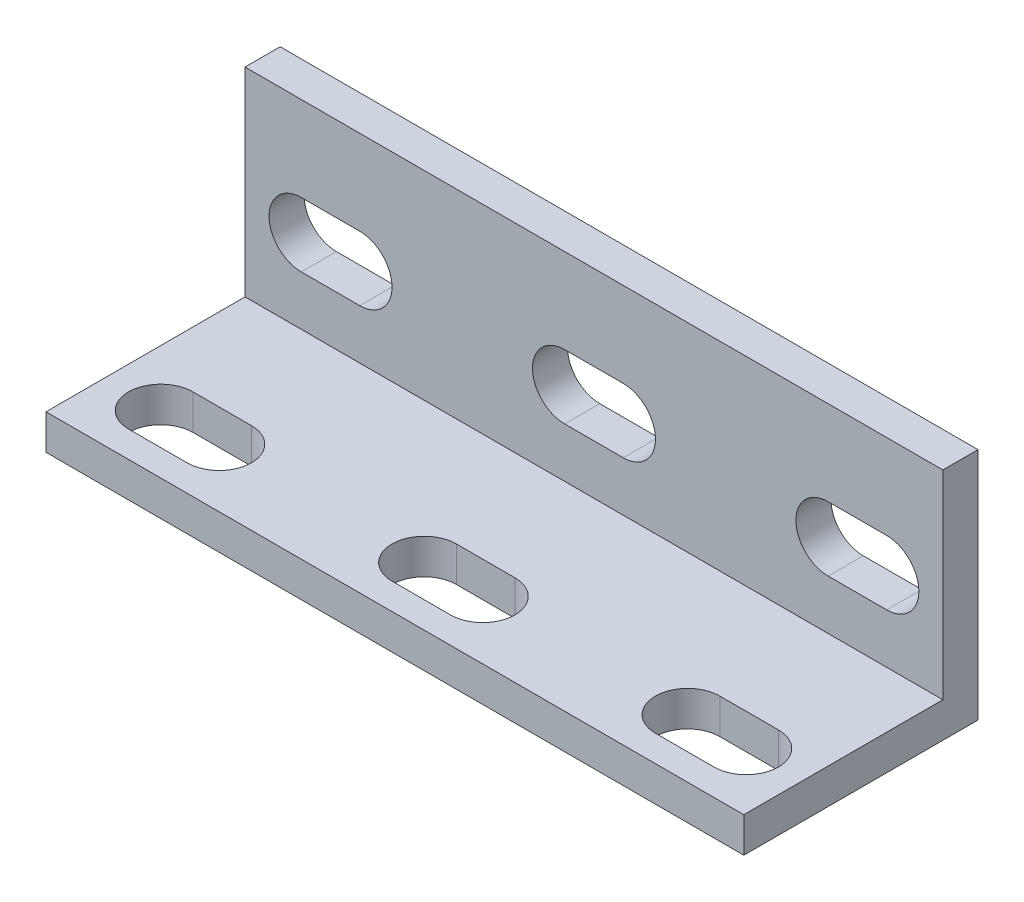
ISO-10303-21;
HEADER;
FILE_DESCRIPTION(('STEP AP214'),'2;1');
FILE_NAME('part.step','',(''),(''),'','','');
FILE_SCHEMA(('AUTOMOTIVE_DESIGN { 1 0 10303 214 1 1 1 1 }'));
ENDSEC;
DATA;
#1=APPLICATION_CONTEXT('core data for automotive mechanical design processes');
#2=APPLICATION_PROTOCOL_DEFINITION('international standard','automotive_design',2000,#1);
#3=PRODUCT_CONTEXT('',#1,'mechanical');
#4=PRODUCT('Part','Part','',(#3));
#5=PRODUCT_RELATED_PRODUCT_CATEGORY('part','',(#4));
#6=PRODUCT_DEFINITION_FORMATION('','',#4);
#7=PRODUCT_DEFINITION_CONTEXT('part definition',#1,'design');
#8=PRODUCT_DEFINITION('design','',#6,#7);
#9=PRODUCT_DEFINITION_SHAPE('','',#8);
#10=(LENGTH_UNIT() NAMED_UNIT(*) SI_UNIT(.MILLI.,.METRE.));
#11=(NAMED_UNIT(*) PLANE_ANGLE_UNIT() SI_UNIT($,.RADIAN.));
#12=(NAMED_UNIT(*) SI_UNIT($,.STERADIAN.) SOLID_ANGLE_UNIT());
#13=UNCERTAINTY_MEASURE_WITH_UNIT(LENGTH_MEASURE(1.E-05),#10,'distance_accuracy_value','');
#14=(GEOMETRIC_REPRESENTATION_CONTEXT(3) GLOBAL_UNCERTAINTY_ASSIGNED_CONTEXT((#13)) GLOBAL_UNIT_ASSIGNED_CONTEXT((#10,
#11,#12)) REPRESENTATION_CONTEXT('',''));
#15=CARTESIAN_POINT('',(0.,0.,0.));
#16=DIRECTION('',(0.,0.,1.));
#17=DIRECTION('',(1.,0.,0.));
#18=AXIS2_PLACEMENT_3D('',#15,#16,#17);
#19=CARTESIAN_POINT('',(29.8,0.,20.));
#20=DIRECTION('',(0.,1.,0.));
#21=DIRECTION('',(0.,0.,1.));
#22=AXIS2_PLACEMENT_3D('',#19,#20,#21);
#23=PLANE('',#22);
#24=DIRECTION('',(1.,0.,0.));
#25=VECTOR('',#24,1.);
#26=CARTESIAN_POINT('',(-25.,0.,12.2500000000002));
#27=LINE('',#26,#25);
#28=CARTESIAN_POINT('',(-25.,0.,12.2500000000002));
#29=VERTEX_POINT('',#28);
#30=CARTESIAN_POINT('',(-20.,0.,12.2500000000002));
#31=VERTEX_POINT('',#30);
#32=EDGE_CURVE('E324',#29,#31,#27,.T.);
#33=ORIENTED_EDGE('',*,*,#32,.F.);
#34=CARTESIAN_POINT('',(-25.,0.,15.0000000000002));
#35=DIRECTION('',(0.,1.,0.));
#36=DIRECTION('',(0.,0.,1.));
#37=AXIS2_PLACEMENT_3D('',#34,#35,#36);
#38=CIRCLE('',#37,2.75);
#39=CARTESIAN_POINT('',(-25.,0.,17.7500000000002));
#40=VERTEX_POINT('',#39);
#41=EDGE_CURVE('E327',#40,#29,#38,.F.);
#42=ORIENTED_EDGE('',*,*,#41,.F.);
#43=DIRECTION('',(-1.,0.,0.));
#44=VECTOR('',#43,1.);
#45=CARTESIAN_POINT('',(-25.,0.,17.7500000000002));
#46=LINE('',#45,#44);
#47=CARTESIAN_POINT('',(-20.,0.,17.7500000000002));
#48=VERTEX_POINT('',#47);
#49=EDGE_CURVE('E329',#48,#40,#46,.T.);
#50=ORIENTED_EDGE('',*,*,#49,.F.);
#51=CARTESIAN_POINT('',(-20.,0.,15.0000000000002));
#52=DIRECTION('',(0.,1.,0.));
#53=DIRECTION('',(0.,0.,1.));
#54=AXIS2_PLACEMENT_3D('',#51,#52,#53);
#55=CIRCLE('',#54,2.75);
#56=EDGE_CURVE('E321',#31,#48,#55,.F.);
#57=ORIENTED_EDGE('',*,*,#56,.F.);
#58=EDGE_LOOP('',(#33,#42,#50,#57));
#59=FACE_BOUND('',#58,.T.);
#60=DIRECTION('',(1.,0.,0.));
#61=VECTOR('',#60,1.);
#62=CARTESIAN_POINT('',(20.,0.,12.25));
#63=LINE('',#62,#61);
#64=CARTESIAN_POINT('',(20.,0.,12.25));
#65=VERTEX_POINT('',#64);
#66=CARTESIAN_POINT('',(25.,0.,12.25));
#67=VERTEX_POINT('',#66);
#68=EDGE_CURVE('E353',#65,#67,#63,.T.);
#69=ORIENTED_EDGE('',*,*,#68,.F.);
#70=CARTESIAN_POINT('',(20.,0.,15.));
#71=DIRECTION('',(0.,1.,0.));
#72=DIRECTION('',(0.,0.,1.));
#73=AXIS2_PLACEMENT_3D('',#70,#71,#72);
#74=CIRCLE('',#73,2.75);
#75=CARTESIAN_POINT('',(20.,0.,17.75));
#76=VERTEX_POINT('',#75);
#77=EDGE_CURVE('E356',#76,#65,#74,.F.);
#78=ORIENTED_EDGE('',*,*,#77,.F.);
#79=DIRECTION('',(-1.,0.,0.));
#80=VECTOR('',#79,1.);
#81=CARTESIAN_POINT('',(20.,0.,17.75));
#82=LINE('',#81,#80);
#83=CARTESIAN_POINT('',(25.,0.,17.75));
#84=VERTEX_POINT('',#83);
#85=EDGE_CURVE('E358',#84,#76,#82,.T.);
#86=ORIENTED_EDGE('',*,*,#85,.F.);
#87=CARTESIAN_POINT('',(25.,0.,15.));
#88=DIRECTION('',(0.,1.,0.));
#89=DIRECTION('',(0.,0.,1.));
#90=AXIS2_PLACEMENT_3D('',#87,#88,#89);
#91=CIRCLE('',#90,2.75);
#92=EDGE_CURVE('E350',#67,#84,#91,.F.);
#93=ORIENTED_EDGE('',*,*,#92,.F.);
#94=EDGE_LOOP('',(#69,#78,#86,#93));
#95=FACE_BOUND('',#94,.T.);
#96=DIRECTION('',(1.,0.,0.));
#97=VECTOR('',#96,1.);
#98=CARTESIAN_POINT('',(-2.5,0.,12.25));
#99=LINE('',#98,#97);
#100=CARTESIAN_POINT('',(-2.5,0.,12.25));
#101=VERTEX_POINT('',#100);
#102=CARTESIAN_POINT('',(2.5,0.,12.25));
#103=VERTEX_POINT('',#102);
#104=EDGE_CURVE('E382',#101,#103,#99,.T.);
#105=ORIENTED_EDGE('',*,*,#104,.F.);
#106=CARTESIAN_POINT('',(-2.5,0.,15.));
#107=DIRECTION('',(0.,1.,0.));
#108=DIRECTION('',(0.,0.,1.));
#109=AXIS2_PLACEMENT_3D('',#106,#107,#108);
#110=CIRCLE('',#109,2.75);
#111=CARTESIAN_POINT('',(-2.5,0.,17.75));
#112=VERTEX_POINT('',#111);
#113=EDGE_CURVE('E385',#112,#101,#110,.F.);
#114=ORIENTED_EDGE('',*,*,#113,.F.);
#115=DIRECTION('',(-1.,0.,0.));
#116=VECTOR('',#115,1.);
#117=CARTESIAN_POINT('',(-2.5,0.,17.75));
#118=LINE('',#117,#116);
#119=CARTESIAN_POINT('',(2.5,0.,17.75));
#120=VERTEX_POINT('',#119);
#121=EDGE_CURVE('E387',#120,#112,#118,.T.);
#122=ORIENTED_EDGE('',*,*,#121,.F.);
#123=CARTESIAN_POINT('',(2.5,0.,15.));
#124=DIRECTION('',(0.,1.,0.));
#125=DIRECTION('',(0.,0.,1.));
#126=AXIS2_PLACEMENT_3D('',#123,#124,#125);
#127=CIRCLE('',#126,2.75);
#128=EDGE_CURVE('E379',#103,#120,#127,.F.);
#129=ORIENTED_EDGE('',*,*,#128,.F.);
#130=EDGE_LOOP('',(#105,#114,#122,#129));
#131=FACE_BOUND('',#130,.T.);
#132=DIRECTION('',(0.,0.,-1.));
#133=VECTOR('',#132,1.);
#134=CARTESIAN_POINT('',(-29.8,0.,20.));
#135=LINE('',#134,#133);
#136=CARTESIAN_POINT('',(-29.8,0.,20.));
#137=VERTEX_POINT('',#136);
#138=CARTESIAN_POINT('',(-29.8,0.,0.));
#139=VERTEX_POINT('',#138);
#140=EDGE_CURVE('E407',#137,#139,#135,.T.);
#141=ORIENTED_EDGE('',*,*,#140,.T.);
#142=DIRECTION('',(-1.,0.,0.));
#143=VECTOR('',#142,1.);
#144=CARTESIAN_POINT('',(29.8,0.,0.));
#145=LINE('',#144,#143);
#146=CARTESIAN_POINT('',(29.8,0.,0.));
#147=VERTEX_POINT('',#146);
#148=EDGE_CURVE('E11',#147,#139,#145,.T.);
#149=ORIENTED_EDGE('',*,*,#148,.F.);
#150=DIRECTION('',(0.,0.,-1.));
#151=VECTOR('',#150,1.);
#152=CARTESIAN_POINT('',(29.8,0.,20.));
#153=LINE('',#152,#151);
#154=CARTESIAN_POINT('',(29.8,0.,20.));
#155=VERTEX_POINT('',#154);
#156=EDGE_CURVE('E408',#155,#147,#153,.T.);
#157=ORIENTED_EDGE('',*,*,#156,.F.);
#158=DIRECTION('',(-1.,0.,0.));
#159=VECTOR('',#158,1.);
#160=CARTESIAN_POINT('',(29.8,0.,20.));
#161=LINE('',#160,#159);
#162=EDGE_CURVE('E422',#155,#137,#161,.T.);
#163=ORIENTED_EDGE('',*,*,#162,.T.);
#164=EDGE_LOOP('',(#141,#149,#157,#163));
#165=FACE_BOUND('',#164,.T.);
#166=ADVANCED_FACE('F35',(#59,#95,#131,#165),#23,.F.);
#167=CARTESIAN_POINT('',(29.8,0.,0.));
#168=DIRECTION('',(0.,0.,1.));
#169=DIRECTION('',(1.,0.,0.));
#170=AXIS2_PLACEMENT_3D('',#167,#168,#169);
#171=PLANE('',#170);
#172=DIRECTION('',(-1.,0.,0.));
#173=VECTOR('',#172,1.);
#174=CARTESIAN_POINT('',(-20.,7.24999999999985,0.));
#175=LINE('',#174,#173);
#176=CARTESIAN_POINT('',(-20.,7.24999999999985,0.));
#177=VERTEX_POINT('',#176);
#178=CARTESIAN_POINT('',(-25.,7.24999999999985,0.));
#179=VERTEX_POINT('',#178);
#180=EDGE_CURVE('E770',#177,#179,#175,.T.);
#181=ORIENTED_EDGE('',*,*,#180,.F.);
#182=CARTESIAN_POINT('',(-20.,9.99999999999984,0.));
#183=DIRECTION('',(0.,0.,1.));
#184=DIRECTION('',(1.,0.,0.));
#185=AXIS2_PLACEMENT_3D('',#182,#183,#184);
#186=CIRCLE('',#185,2.75);
#187=CARTESIAN_POINT('',(-20.,12.7499999999998,0.));
#188=VERTEX_POINT('',#187);
#189=EDGE_CURVE('E262',#188,#177,#186,.F.);
#190=ORIENTED_EDGE('',*,*,#189,.F.);
#191=DIRECTION('',(1.,0.,0.));
#192=VECTOR('',#191,1.);
#193=CARTESIAN_POINT('',(-25.,12.7499999999998,0.));
#194=LINE('',#193,#192);
#195=CARTESIAN_POINT('',(-25.,12.7499999999998,0.));
#196=VERTEX_POINT('',#195);
#197=EDGE_CURVE('E259',#196,#188,#194,.T.);
#198=ORIENTED_EDGE('',*,*,#197,.F.);
#199=CARTESIAN_POINT('',(-25.,9.99999999999984,0.));
#200=DIRECTION('',(0.,0.,1.));
#201=DIRECTION('',(1.,0.,0.));
#202=AXIS2_PLACEMENT_3D('',#199,#200,#201);
#203=CIRCLE('',#202,2.75);
#204=EDGE_CURVE('E237',#179,#196,#203,.F.);
#205=ORIENTED_EDGE('',*,*,#204,.F.);
#206=EDGE_LOOP('',(#181,#190,#198,#205));
#207=FACE_BOUND('',#206,.T.);
#208=DIRECTION('',(-1.,0.,0.));
#209=VECTOR('',#208,1.);
#210=CARTESIAN_POINT('',(25.,7.25,0.));
#211=LINE('',#210,#209);
#212=CARTESIAN_POINT('',(25.,7.25,0.));
#213=VERTEX_POINT('',#212);
#214=CARTESIAN_POINT('',(20.,7.25,0.));
#215=VERTEX_POINT('',#214);
#216=EDGE_CURVE('E266',#213,#215,#211,.T.);
#217=ORIENTED_EDGE('',*,*,#216,.F.);
#218=CARTESIAN_POINT('',(25.,10.,0.));
#219=DIRECTION('',(0.,0.,1.));
#220=DIRECTION('',(1.,0.,0.));
#221=AXIS2_PLACEMENT_3D('',#218,#219,#220);
#222=CIRCLE('',#221,2.75);
#223=CARTESIAN_POINT('',(25.,12.75,0.));
#224=VERTEX_POINT('',#223);
#225=EDGE_CURVE('E269',#224,#213,#222,.F.);
#226=ORIENTED_EDGE('',*,*,#225,.F.);
#227=DIRECTION('',(1.,0.,0.));
#228=VECTOR('',#227,1.);
#229=CARTESIAN_POINT('',(20.,12.75,0.));
#230=LINE('',#229,#228);
#231=CARTESIAN_POINT('',(20.,12.75,0.));
#232=VERTEX_POINT('',#231);
#233=EDGE_CURVE('E271',#232,#224,#230,.T.);
#234=ORIENTED_EDGE('',*,*,#233,.F.);
#235=CARTESIAN_POINT('',(20.,10.,0.));
#236=DIRECTION('',(0.,0.,1.));
#237=DIRECTION('',(1.,0.,0.));
#238=AXIS2_PLACEMENT_3D('',#235,#236,#237);
#239=CIRCLE('',#238,2.75);
#240=EDGE_CURVE('E263',#215,#232,#239,.F.);
#241=ORIENTED_EDGE('',*,*,#240,.F.);
#242=EDGE_LOOP('',(#217,#226,#234,#241));
#243=FACE_BOUND('',#242,.T.);
#244=DIRECTION('',(-1.,0.,0.));
#245=VECTOR('',#244,1.);
#246=CARTESIAN_POINT('',(2.5,7.25,0.));
#247=LINE('',#246,#245);
#248=CARTESIAN_POINT('',(2.5,7.25,0.));
#249=VERTEX_POINT('',#248);
#250=CARTESIAN_POINT('',(-2.5,7.25,0.));
#251=VERTEX_POINT('',#250);
#252=EDGE_CURVE('E295',#249,#251,#247,.T.);
#253=ORIENTED_EDGE('',*,*,#252,.F.);
#254=CARTESIAN_POINT('',(2.5,10.,0.));
#255=DIRECTION('',(0.,0.,1.));
#256=DIRECTION('',(1.,0.,0.));
#257=AXIS2_PLACEMENT_3D('',#254,#255,#256);
#258=CIRCLE('',#257,2.75);
#259=CARTESIAN_POINT('',(2.5,12.75,0.));
#260=VERTEX_POINT('',#259);
#261=EDGE_CURVE('E298',#260,#249,#258,.F.);
#262=ORIENTED_EDGE('',*,*,#261,.F.);
#263=DIRECTION('',(1.,0.,0.));
#264=VECTOR('',#263,1.);
#265=CARTESIAN_POINT('',(-2.5,12.75,0.));
#266=LINE('',#265,#264);
#267=CARTESIAN_POINT('',(-2.5,12.75,0.));
#268=VERTEX_POINT('',#267);
#269=EDGE_CURVE('E300',#268,#260,#266,.T.);
#270=ORIENTED_EDGE('',*,*,#269,.F.);
#271=CARTESIAN_POINT('',(-2.5,10.,0.));
#272=DIRECTION('',(0.,0.,1.));
#273=DIRECTION('',(1.,0.,0.));
#274=AXIS2_PLACEMENT_3D('',#271,#272,#273);
#275=CIRCLE('',#274,2.75);
#276=EDGE_CURVE('E292',#251,#268,#275,.F.);
#277=ORIENTED_EDGE('',*,*,#276,.F.);
#278=EDGE_LOOP('',(#253,#262,#270,#277));
#279=FACE_BOUND('',#278,.T.);
#280=DIRECTION('',(0.,1.,0.));
#281=VECTOR('',#280,1.);
#282=CARTESIAN_POINT('',(-29.8,0.,0.));
#283=LINE('',#282,#281);
#284=CARTESIAN_POINT('',(-29.8,20.,0.));
#285=VERTEX_POINT('',#284);
#286=EDGE_CURVE('E425',#139,#285,#283,.T.);
#287=ORIENTED_EDGE('',*,*,#286,.T.);
#288=DIRECTION('',(-1.,0.,0.));
#289=VECTOR('',#288,1.);
#290=CARTESIAN_POINT('',(29.8,20.,0.));
#291=LINE('',#290,#289);
#292=CARTESIAN_POINT('',(29.8,20.,0.));
#293=VERTEX_POINT('',#292);
#294=EDGE_CURVE('E42',#293,#285,#291,.T.);
#295=ORIENTED_EDGE('',*,*,#294,.F.);
#296=DIRECTION('',(0.,1.,0.));
#297=VECTOR('',#296,1.);
#298=CARTESIAN_POINT('',(29.8,0.,0.));
#299=LINE('',#298,#297);
#300=EDGE_CURVE('E411',#147,#293,#299,.T.);
#301=ORIENTED_EDGE('',*,*,#300,.F.);
#302=ORIENTED_EDGE('',*,*,#148,.T.);
#303=EDGE_LOOP('',(#287,#295,#301,#302));
#304=FACE_BOUND('',#303,.T.);
#305=ADVANCED_FACE('F471',(#207,#243,#279,#304),#171,.F.);
#306=CARTESIAN_POINT('',(29.8,20.,0.));
#307=DIRECTION('',(0.,-1.,0.));
#308=DIRECTION('',(0.,0.,-1.));
#309=AXIS2_PLACEMENT_3D('',#306,#307,#308);
#310=PLANE('',#309);
#311=DIRECTION('',(0.,0.,1.));
#312=VECTOR('',#311,1.);
#313=CARTESIAN_POINT('',(-29.8,20.,0.));
#314=LINE('',#313,#312);
#315=CARTESIAN_POINT('',(-29.8,20.,3.));
#316=VERTEX_POINT('',#315);
#317=EDGE_CURVE('E427',#285,#316,#314,.T.);
#318=ORIENTED_EDGE('',*,*,#317,.T.);
#319=DIRECTION('',(-1.,0.,0.));
#320=VECTOR('',#319,1.);
#321=CARTESIAN_POINT('',(29.8,20.,3.));
#322=LINE('',#321,#320);
#323=CARTESIAN_POINT('',(29.8,20.,3.));
#324=VERTEX_POINT('',#323);
#325=EDGE_CURVE('E442',#324,#316,#322,.T.);
#326=ORIENTED_EDGE('',*,*,#325,.F.);
#327=DIRECTION('',(0.,0.,1.));
#328=VECTOR('',#327,1.);
#329=CARTESIAN_POINT('',(29.8,20.,0.));
#330=LINE('',#329,#328);
#331=EDGE_CURVE('E414',#293,#324,#330,.T.);
#332=ORIENTED_EDGE('',*,*,#331,.F.);
#333=ORIENTED_EDGE('',*,*,#294,.T.);
#334=EDGE_LOOP('',(#318,#326,#332,#333));
#335=FACE_BOUND('',#334,.T.);
#336=ADVANCED_FACE('F449',(#335),#310,.F.);
#337=CARTESIAN_POINT('',(29.8,20.,3.));
#338=DIRECTION('',(0.,0.,-1.));
#339=DIRECTION('',(0.,1.,0.));
#340=AXIS2_PLACEMENT_3D('',#337,#338,#339);
#341=PLANE('',#340);
#342=DIRECTION('',(-1.,0.,0.));
#343=VECTOR('',#342,1.);
#344=CARTESIAN_POINT('',(-25.,12.7499999999998,3.));
#345=LINE('',#344,#343);
#346=CARTESIAN_POINT('',(-20.,12.7499999999998,3.));
#347=VERTEX_POINT('',#346);
#348=CARTESIAN_POINT('',(-25.,12.7499999999998,3.));
#349=VERTEX_POINT('',#348);
#350=EDGE_CURVE('E243',#347,#349,#345,.T.);
#351=ORIENTED_EDGE('',*,*,#350,.F.);
#352=CARTESIAN_POINT('',(-20.,9.99999999999984,3.));
#353=DIRECTION('',(0.,0.,1.));
#354=DIRECTION('',(1.,0.,0.));
#355=AXIS2_PLACEMENT_3D('',#352,#353,#354);
#356=CIRCLE('',#355,2.75);
#357=CARTESIAN_POINT('',(-20.,7.24999999999985,3.));
#358=VERTEX_POINT('',#357);
#359=EDGE_CURVE('E57',#358,#347,#356,.T.);
#360=ORIENTED_EDGE('',*,*,#359,.F.);
#361=DIRECTION('',(1.,0.,0.));
#362=VECTOR('',#361,1.);
#363=CARTESIAN_POINT('',(-20.,7.24999999999985,3.));
#364=LINE('',#363,#362);
#365=CARTESIAN_POINT('',(-25.,7.24999999999985,3.));
#366=VERTEX_POINT('',#365);
#367=EDGE_CURVE('E250',#366,#358,#364,.T.);
#368=ORIENTED_EDGE('',*,*,#367,.F.);
#369=CARTESIAN_POINT('',(-25.,9.99999999999984,3.));
#370=DIRECTION('',(0.,0.,1.));
#371=DIRECTION('',(1.,0.,0.));
#372=AXIS2_PLACEMENT_3D('',#369,#370,#371);
#373=CIRCLE('',#372,2.75);
#374=EDGE_CURVE('E234',#349,#366,#373,.T.);
#375=ORIENTED_EDGE('',*,*,#374,.F.);
#376=EDGE_LOOP('',(#351,#360,#368,#375));
#377=FACE_BOUND('',#376,.T.);
#378=DIRECTION('',(-1.,0.,0.));
#379=VECTOR('',#378,1.);
#380=CARTESIAN_POINT('',(20.,12.75,3.));
#381=LINE('',#380,#379);
#382=CARTESIAN_POINT('',(25.,12.75,3.));
#383=VERTEX_POINT('',#382);
#384=CARTESIAN_POINT('',(20.,12.75,3.));
#385=VERTEX_POINT('',#384);
#386=EDGE_CURVE('E273',#383,#385,#381,.T.);
#387=ORIENTED_EDGE('',*,*,#386,.F.);
#388=CARTESIAN_POINT('',(25.,10.,3.));
#389=DIRECTION('',(0.,0.,1.));
#390=DIRECTION('',(1.,0.,0.));
#391=AXIS2_PLACEMENT_3D('',#388,#389,#390);
#392=CIRCLE('',#391,2.75);
#393=CARTESIAN_POINT('',(25.,7.25,3.));
#394=VERTEX_POINT('',#393);
#395=EDGE_CURVE('E261',#394,#383,#392,.T.);
#396=ORIENTED_EDGE('',*,*,#395,.F.);
#397=DIRECTION('',(1.,0.,0.));
#398=VECTOR('',#397,1.);
#399=CARTESIAN_POINT('',(25.,7.25,3.));
#400=LINE('',#399,#398);
#401=CARTESIAN_POINT('',(20.,7.25,3.));
#402=VERTEX_POINT('',#401);
#403=EDGE_CURVE('E279',#402,#394,#400,.T.);
#404=ORIENTED_EDGE('',*,*,#403,.F.);
#405=CARTESIAN_POINT('',(20.,10.,3.));
#406=DIRECTION('',(0.,0.,1.));
#407=DIRECTION('',(1.,0.,0.));
#408=AXIS2_PLACEMENT_3D('',#405,#406,#407);
#409=CIRCLE('',#408,2.75);
#410=EDGE_CURVE('E276',#385,#402,#409,.T.);
#411=ORIENTED_EDGE('',*,*,#410,.F.);
#412=EDGE_LOOP('',(#387,#396,#404,#411));
#413=FACE_BOUND('',#412,.T.);
#414=DIRECTION('',(-1.,0.,0.));
#415=VECTOR('',#414,1.);
#416=CARTESIAN_POINT('',(-2.5,12.75,3.));
#417=LINE('',#416,#415);
#418=CARTESIAN_POINT('',(2.5,12.75,3.));
#419=VERTEX_POINT('',#418);
#420=CARTESIAN_POINT('',(-2.5,12.75,3.));
#421=VERTEX_POINT('',#420);
#422=EDGE_CURVE('E302',#419,#421,#417,.T.);
#423=ORIENTED_EDGE('',*,*,#422,.F.);
#424=CARTESIAN_POINT('',(2.5,10.,3.));
#425=DIRECTION('',(0.,0.,1.));
#426=DIRECTION('',(1.,0.,0.));
#427=AXIS2_PLACEMENT_3D('',#424,#425,#426);
#428=CIRCLE('',#427,2.75);
#429=CARTESIAN_POINT('',(2.5,7.25,3.));
#430=VERTEX_POINT('',#429);
#431=EDGE_CURVE('E291',#430,#419,#428,.T.);
#432=ORIENTED_EDGE('',*,*,#431,.F.);
#433=DIRECTION('',(1.,0.,0.));
#434=VECTOR('',#433,1.);
#435=CARTESIAN_POINT('',(2.5,7.25,3.));
#436=LINE('',#435,#434);
#437=CARTESIAN_POINT('',(-2.5,7.25,3.));
#438=VERTEX_POINT('',#437);
#439=EDGE_CURVE('E308',#438,#430,#436,.T.);
#440=ORIENTED_EDGE('',*,*,#439,.F.);
#441=CARTESIAN_POINT('',(-2.5,10.,3.));
#442=DIRECTION('',(0.,0.,1.));
#443=DIRECTION('',(1.,0.,0.));
#444=AXIS2_PLACEMENT_3D('',#441,#442,#443);
#445=CIRCLE('',#444,2.75);
#446=EDGE_CURVE('E305',#421,#438,#445,.T.);
#447=ORIENTED_EDGE('',*,*,#446,.F.);
#448=EDGE_LOOP('',(#423,#432,#440,#447));
#449=FACE_BOUND('',#448,.T.);
#450=DIRECTION('',(0.,-1.,0.));
#451=VECTOR('',#450,1.);
#452=CARTESIAN_POINT('',(-29.8,20.,3.));
#453=LINE('',#452,#451);
#454=CARTESIAN_POINT('',(-29.8,3.,3.));
#455=VERTEX_POINT('',#454);
#456=EDGE_CURVE('E429',#316,#455,#453,.T.);
#457=ORIENTED_EDGE('',*,*,#456,.T.);
#458=DIRECTION('',(-1.,0.,0.));
#459=VECTOR('',#458,1.);
#460=CARTESIAN_POINT('',(29.8,3.,3.));
#461=LINE('',#460,#459);
#462=CARTESIAN_POINT('',(29.8,3.,3.));
#463=VERTEX_POINT('',#462);
#464=EDGE_CURVE('E439',#463,#455,#461,.T.);
#465=ORIENTED_EDGE('',*,*,#464,.F.);
#466=DIRECTION('',(0.,-1.,0.));
#467=VECTOR('',#466,1.);
#468=CARTESIAN_POINT('',(29.8,20.,3.));
#469=LINE('',#468,#467);
#470=EDGE_CURVE('E416',#324,#463,#469,.T.);
#471=ORIENTED_EDGE('',*,*,#470,.F.);
#472=ORIENTED_EDGE('',*,*,#325,.T.);
#473=EDGE_LOOP('',(#457,#465,#471,#472));
#474=FACE_BOUND('',#473,.T.);
#475=ADVANCED_FACE('F247',(#377,#413,#449,#474),#341,.F.);
#476=CARTESIAN_POINT('',(29.8,3.,3.));
#477=DIRECTION('',(0.,-1.,0.));
#478=DIRECTION('',(0.,0.,-1.));
#479=AXIS2_PLACEMENT_3D('',#476,#477,#478);
#480=PLANE('',#479);
#481=DIRECTION('',(1.,0.,0.));
#482=VECTOR('',#481,1.);
#483=CARTESIAN_POINT('',(-25.,3.,17.7500000000002));
#484=LINE('',#483,#482);
#485=CARTESIAN_POINT('',(-25.,3.,17.7500000000002));
#486=VERTEX_POINT('',#485);
#487=CARTESIAN_POINT('',(-20.,3.,17.7500000000002));
#488=VERTEX_POINT('',#487);
#489=EDGE_CURVE('E331',#486,#488,#484,.T.);
#490=ORIENTED_EDGE('',*,*,#489,.F.);
#491=CARTESIAN_POINT('',(-25.,3.,15.0000000000002));
#492=DIRECTION('',(0.,1.,0.));
#493=DIRECTION('',(0.,0.,1.));
#494=AXIS2_PLACEMENT_3D('',#491,#492,#493);
#495=CIRCLE('',#494,2.75);
#496=CARTESIAN_POINT('',(-25.,3.,12.2500000000002));
#497=VERTEX_POINT('',#496);
#498=EDGE_CURVE('E320',#497,#486,#495,.T.);
#499=ORIENTED_EDGE('',*,*,#498,.F.);
#500=DIRECTION('',(-1.,0.,0.));
#501=VECTOR('',#500,1.);
#502=CARTESIAN_POINT('',(-25.,3.,12.2500000000002));
#503=LINE('',#502,#501);
#504=CARTESIAN_POINT('',(-20.,3.,12.2500000000002));
#505=VERTEX_POINT('',#504);
#506=EDGE_CURVE('E337',#505,#497,#503,.T.);
#507=ORIENTED_EDGE('',*,*,#506,.F.);
#508=CARTESIAN_POINT('',(-20.,3.,15.0000000000002));
#509=DIRECTION('',(0.,1.,0.));
#510=DIRECTION('',(0.,0.,1.));
#511=AXIS2_PLACEMENT_3D('',#508,#509,#510);
#512=CIRCLE('',#511,2.75);
#513=EDGE_CURVE('E334',#488,#505,#512,.T.);
#514=ORIENTED_EDGE('',*,*,#513,.F.);
#515=EDGE_LOOP('',(#490,#499,#507,#514));
#516=FACE_BOUND('',#515,.T.);
#517=DIRECTION('',(1.,0.,0.));
#518=VECTOR('',#517,1.);
#519=CARTESIAN_POINT('',(20.,3.,17.75));
#520=LINE('',#519,#518);
#521=CARTESIAN_POINT('',(20.,3.,17.75));
#522=VERTEX_POINT('',#521);
#523=CARTESIAN_POINT('',(25.,3.,17.75));
#524=VERTEX_POINT('',#523);
#525=EDGE_CURVE('E360',#522,#524,#520,.T.);
#526=ORIENTED_EDGE('',*,*,#525,.F.);
#527=CARTESIAN_POINT('',(20.,3.,15.));
#528=DIRECTION('',(0.,1.,0.));
#529=DIRECTION('',(0.,0.,1.));
#530=AXIS2_PLACEMENT_3D('',#527,#528,#529);
#531=CIRCLE('',#530,2.75);
#532=CARTESIAN_POINT('',(20.,3.,12.25));
#533=VERTEX_POINT('',#532);
#534=EDGE_CURVE('E349',#533,#522,#531,.T.);
#535=ORIENTED_EDGE('',*,*,#534,.F.);
#536=DIRECTION('',(-1.,0.,0.));
#537=VECTOR('',#536,1.);
#538=CARTESIAN_POINT('',(20.,3.,12.25));
#539=LINE('',#538,#537);
#540=CARTESIAN_POINT('',(25.,3.,12.25));
#541=VERTEX_POINT('',#540);
#542=EDGE_CURVE('E366',#541,#533,#539,.T.);
#543=ORIENTED_EDGE('',*,*,#542,.F.);
#544=CARTESIAN_POINT('',(25.,3.,15.));
#545=DIRECTION('',(0.,1.,0.));
#546=DIRECTION('',(0.,0.,1.));
#547=AXIS2_PLACEMENT_3D('',#544,#545,#546);
#548=CIRCLE('',#547,2.75);
#549=EDGE_CURVE('E363',#524,#541,#548,.T.);
#550=ORIENTED_EDGE('',*,*,#549,.F.);
#551=EDGE_LOOP('',(#526,#535,#543,#550));
#552=FACE_BOUND('',#551,.T.);
#553=DIRECTION('',(1.,0.,0.));
#554=VECTOR('',#553,1.);
#555=CARTESIAN_POINT('',(-2.5,3.,17.75));
#556=LINE('',#555,#554);
#557=CARTESIAN_POINT('',(-2.5,3.,17.75));
#558=VERTEX_POINT('',#557);
#559=CARTESIAN_POINT('',(2.5,3.,17.75));
#560=VERTEX_POINT('',#559);
#561=EDGE_CURVE('E389',#558,#560,#556,.T.);
#562=ORIENTED_EDGE('',*,*,#561,.F.);
#563=CARTESIAN_POINT('',(-2.5,3.,15.));
#564=DIRECTION('',(0.,1.,0.));
#565=DIRECTION('',(0.,0.,1.));
#566=AXIS2_PLACEMENT_3D('',#563,#564,#565);
#567=CIRCLE('',#566,2.75);
#568=CARTESIAN_POINT('',(-2.5,3.,12.25));
#569=VERTEX_POINT('',#568);
#570=EDGE_CURVE('E378',#569,#558,#567,.T.);
#571=ORIENTED_EDGE('',*,*,#570,.F.);
#572=DIRECTION('',(-1.,0.,0.));
#573=VECTOR('',#572,1.);
#574=CARTESIAN_POINT('',(-2.5,3.,12.25));
#575=LINE('',#574,#573);
#576=CARTESIAN_POINT('',(2.5,3.,12.25));
#577=VERTEX_POINT('',#576);
#578=EDGE_CURVE('E395',#577,#569,#575,.T.);
#579=ORIENTED_EDGE('',*,*,#578,.F.);
#580=CARTESIAN_POINT('',(2.5,3.,15.));
#581=DIRECTION('',(0.,1.,0.));
#582=DIRECTION('',(0.,0.,1.));
#583=AXIS2_PLACEMENT_3D('',#580,#581,#582);
#584=CIRCLE('',#583,2.75);
#585=EDGE_CURVE('E392',#560,#577,#584,.T.);
#586=ORIENTED_EDGE('',*,*,#585,.F.);
#587=EDGE_LOOP('',(#562,#571,#579,#586));
#588=FACE_BOUND('',#587,.T.);
#589=DIRECTION('',(0.,0.,1.));
#590=VECTOR('',#589,1.);
#591=CARTESIAN_POINT('',(-29.8,3.,3.));
#592=LINE('',#591,#590);
#593=CARTESIAN_POINT('',(-29.8,3.,20.));
#594=VERTEX_POINT('',#593);
#595=EDGE_CURVE('E431',#455,#594,#592,.T.);
#596=ORIENTED_EDGE('',*,*,#595,.T.);
#597=DIRECTION('',(-1.,0.,0.));
#598=VECTOR('',#597,1.);
#599=CARTESIAN_POINT('',(29.8,3.,20.));
#600=LINE('',#599,#598);
#601=CARTESIAN_POINT('',(29.8,3.,20.));
#602=VERTEX_POINT('',#601);
#603=EDGE_CURVE('E436',#602,#594,#600,.T.);
#604=ORIENTED_EDGE('',*,*,#603,.F.);
#605=DIRECTION('',(0.,0.,1.));
#606=VECTOR('',#605,1.);
#607=CARTESIAN_POINT('',(29.8,3.,3.));
#608=LINE('',#607,#606);
#609=EDGE_CURVE('E418',#463,#602,#608,.T.);
#610=ORIENTED_EDGE('',*,*,#609,.F.);
#611=ORIENTED_EDGE('',*,*,#464,.T.);
#612=EDGE_LOOP('',(#596,#604,#610,#611));
#613=FACE_BOUND('',#612,.T.);
#614=ADVANCED_FACE('F463',(#516,#552,#588,#613),#480,.F.);
#615=CARTESIAN_POINT('',(29.8,3.,20.));
#616=DIRECTION('',(0.,0.,-1.));
#617=DIRECTION('',(-1.,0.,0.));
#618=AXIS2_PLACEMENT_3D('',#615,#616,#617);
#619=PLANE('',#618);
#620=DIRECTION('',(0.,-1.,0.));
#621=VECTOR('',#620,1.);
#622=CARTESIAN_POINT('',(-29.8,3.,20.));
#623=LINE('',#622,#621);
#624=EDGE_CURVE('E412',#594,#137,#623,.T.);
#625=ORIENTED_EDGE('',*,*,#624,.T.);
#626=ORIENTED_EDGE('',*,*,#162,.F.);
#627=DIRECTION('',(0.,-1.,0.));
#628=VECTOR('',#627,1.);
#629=CARTESIAN_POINT('',(29.8,3.,20.));
#630=LINE('',#629,#628);
#631=EDGE_CURVE('E420',#602,#155,#630,.T.);
#632=ORIENTED_EDGE('',*,*,#631,.F.);
#633=ORIENTED_EDGE('',*,*,#603,.T.);
#634=EDGE_LOOP('',(#625,#626,#632,#633));
#635=FACE_BOUND('',#634,.T.);
#636=ADVANCED_FACE('F474',(#635),#619,.F.);
#637=CARTESIAN_POINT('',(29.8,0.,0.));
#638=DIRECTION('',(1.,0.,0.));
#639=DIRECTION('',(0.,0.,-1.));
#640=AXIS2_PLACEMENT_3D('',#637,#638,#639);
#641=PLANE('',#640);
#642=ORIENTED_EDGE('',*,*,#156,.T.);
#643=ORIENTED_EDGE('',*,*,#300,.T.);
#644=ORIENTED_EDGE('',*,*,#331,.T.);
#645=ORIENTED_EDGE('',*,*,#470,.T.);
#646=ORIENTED_EDGE('',*,*,#609,.T.);
#647=ORIENTED_EDGE('',*,*,#631,.T.);
#648=EDGE_LOOP('',(#642,#643,#644,#645,#646,#647));
#649=FACE_BOUND('',#648,.T.);
#650=ADVANCED_FACE('F467',(#649),#641,.T.);
#651=CARTESIAN_POINT('',(-29.8,0.,0.));
#652=DIRECTION('',(1.,0.,0.));
#653=DIRECTION('',(0.,0.,-1.));
#654=AXIS2_PLACEMENT_3D('',#651,#652,#653);
#655=PLANE('',#654);
#656=ORIENTED_EDGE('',*,*,#140,.F.);
#657=ORIENTED_EDGE('',*,*,#624,.F.);
#658=ORIENTED_EDGE('',*,*,#595,.F.);
#659=ORIENTED_EDGE('',*,*,#456,.F.);
#660=ORIENTED_EDGE('',*,*,#317,.F.);
#661=ORIENTED_EDGE('',*,*,#286,.F.);
#662=EDGE_LOOP('',(#656,#657,#658,#659,#660,#661));
#663=FACE_BOUND('',#662,.T.);
#664=ADVANCED_FACE('F455',(#663),#655,.F.);
#665=CARTESIAN_POINT('',(-2.5,-11.8532695911297,15.));
#666=DIRECTION('',(0.,1.,0.));
#667=DIRECTION('',(0.,0.,1.));
#668=AXIS2_PLACEMENT_3D('',#665,#666,#667);
#669=CYLINDRICAL_SURFACE('',#668,2.75);
#670=ORIENTED_EDGE('',*,*,#113,.T.);
#671=DIRECTION('',(0.,1.,0.));
#672=VECTOR('',#671,1.);
#673=CARTESIAN_POINT('',(-2.5,-11.8532695911297,12.25));
#674=LINE('',#673,#672);
#675=EDGE_CURVE('E383',#101,#569,#674,.T.);
#676=ORIENTED_EDGE('',*,*,#675,.T.);
#677=ORIENTED_EDGE('',*,*,#570,.T.);
#678=DIRECTION('',(0.,1.,0.));
#679=VECTOR('',#678,1.);
#680=CARTESIAN_POINT('',(-2.5,-11.8532695911297,17.75));
#681=LINE('',#680,#679);
#682=EDGE_CURVE('E398',#112,#558,#681,.T.);
#683=ORIENTED_EDGE('',*,*,#682,.F.);
#684=EDGE_LOOP('',(#670,#676,#677,#683));
#685=FACE_BOUND('',#684,.T.);
#686=ADVANCED_FACE('F516',(#685),#669,.F.);
#687=CARTESIAN_POINT('',(-2.5,-11.8532695911297,12.25));
#688=DIRECTION('',(0.,0.,-1.));
#689=DIRECTION('',(0.,1.,0.));
#690=AXIS2_PLACEMENT_3D('',#687,#688,#689);
#691=PLANE('',#690);
#692=ORIENTED_EDGE('',*,*,#104,.T.);
#693=DIRECTION('',(0.,1.,0.));
#694=VECTOR('',#693,1.);
#695=CARTESIAN_POINT('',(2.5,-11.8532695911297,12.25));
#696=LINE('',#695,#694);
#697=EDGE_CURVE('E400',#103,#577,#696,.T.);
#698=ORIENTED_EDGE('',*,*,#697,.T.);
#699=ORIENTED_EDGE('',*,*,#578,.T.);
#700=ORIENTED_EDGE('',*,*,#675,.F.);
#701=EDGE_LOOP('',(#692,#698,#699,#700));
#702=FACE_BOUND('',#701,.T.);
#703=ADVANCED_FACE('F506',(#702),#691,.F.);
#704=CARTESIAN_POINT('',(2.5,-11.8532695911297,15.));
#705=DIRECTION('',(0.,1.,0.));
#706=DIRECTION('',(0.,0.,1.));
#707=AXIS2_PLACEMENT_3D('',#704,#705,#706);
#708=CYLINDRICAL_SURFACE('',#707,2.75);
#709=ORIENTED_EDGE('',*,*,#128,.T.);
#710=DIRECTION('',(0.,1.,0.));
#711=VECTOR('',#710,1.);
#712=CARTESIAN_POINT('',(2.5,-11.8532695911297,17.75));
#713=LINE('',#712,#711);
#714=EDGE_CURVE('E402',#120,#560,#713,.T.);
#715=ORIENTED_EDGE('',*,*,#714,.T.);
#716=ORIENTED_EDGE('',*,*,#585,.T.);
#717=ORIENTED_EDGE('',*,*,#697,.F.);
#718=EDGE_LOOP('',(#709,#715,#716,#717));
#719=FACE_BOUND('',#718,.T.);
#720=ADVANCED_FACE('F508',(#719),#708,.F.);
#721=CARTESIAN_POINT('',(-2.5,-11.8532695911297,17.75));
#722=DIRECTION('',(0.,0.,1.));
#723=DIRECTION('',(0.,-1.,0.));
#724=AXIS2_PLACEMENT_3D('',#721,#722,#723);
#725=PLANE('',#724);
#726=ORIENTED_EDGE('',*,*,#121,.T.);
#727=ORIENTED_EDGE('',*,*,#682,.T.);
#728=ORIENTED_EDGE('',*,*,#561,.T.);
#729=ORIENTED_EDGE('',*,*,#714,.F.);
#730=EDGE_LOOP('',(#726,#727,#728,#729));
#731=FACE_BOUND('',#730,.T.);
#732=ADVANCED_FACE('F518',(#731),#725,.F.);
#733=CARTESIAN_POINT('',(20.,-11.8532695911297,15.));
#734=DIRECTION('',(0.,1.,0.));
#735=DIRECTION('',(0.,0.,1.));
#736=AXIS2_PLACEMENT_3D('',#733,#734,#735);
#737=CYLINDRICAL_SURFACE('',#736,2.75);
#738=ORIENTED_EDGE('',*,*,#77,.T.);
#739=DIRECTION('',(0.,1.,0.));
#740=VECTOR('',#739,1.);
#741=CARTESIAN_POINT('',(20.,-11.8532695911297,12.25));
#742=LINE('',#741,#740);
#743=EDGE_CURVE('E354',#65,#533,#742,.T.);
#744=ORIENTED_EDGE('',*,*,#743,.T.);
#745=ORIENTED_EDGE('',*,*,#534,.T.);
#746=DIRECTION('',(0.,1.,0.));
#747=VECTOR('',#746,1.);
#748=CARTESIAN_POINT('',(20.,-11.8532695911297,17.75));
#749=LINE('',#748,#747);
#750=EDGE_CURVE('E369',#76,#522,#749,.T.);
#751=ORIENTED_EDGE('',*,*,#750,.F.);
#752=EDGE_LOOP('',(#738,#744,#745,#751));
#753=FACE_BOUND('',#752,.T.);
#754=ADVANCED_FACE('F520',(#753),#737,.F.);
#755=CARTESIAN_POINT('',(20.,-11.8532695911297,12.25));
#756=DIRECTION('',(0.,0.,-1.));
#757=DIRECTION('',(0.,1.,0.));
#758=AXIS2_PLACEMENT_3D('',#755,#756,#757);
#759=PLANE('',#758);
#760=ORIENTED_EDGE('',*,*,#68,.T.);
#761=DIRECTION('',(0.,1.,0.));
#762=VECTOR('',#761,1.);
#763=CARTESIAN_POINT('',(25.,-11.8532695911297,12.25));
#764=LINE('',#763,#762);
#765=EDGE_CURVE('E371',#67,#541,#764,.T.);
#766=ORIENTED_EDGE('',*,*,#765,.T.);
#767=ORIENTED_EDGE('',*,*,#542,.T.);
#768=ORIENTED_EDGE('',*,*,#743,.F.);
#769=EDGE_LOOP('',(#760,#766,#767,#768));
#770=FACE_BOUND('',#769,.T.);
#771=ADVANCED_FACE('F526',(#770),#759,.F.);
#772=CARTESIAN_POINT('',(25.,-11.8532695911297,15.));
#773=DIRECTION('',(0.,1.,0.));
#774=DIRECTION('',(0.,0.,1.));
#775=AXIS2_PLACEMENT_3D('',#772,#773,#774);
#776=CYLINDRICAL_SURFACE('',#775,2.75);
#777=ORIENTED_EDGE('',*,*,#92,.T.);
#778=DIRECTION('',(0.,1.,0.));
#779=VECTOR('',#778,1.);
#780=CARTESIAN_POINT('',(25.,-11.8532695911297,17.75));
#781=LINE('',#780,#779);
#782=EDGE_CURVE('E373',#84,#524,#781,.T.);
#783=ORIENTED_EDGE('',*,*,#782,.T.);
#784=ORIENTED_EDGE('',*,*,#549,.T.);
#785=ORIENTED_EDGE('',*,*,#765,.F.);
#786=EDGE_LOOP('',(#777,#783,#784,#785));
#787=FACE_BOUND('',#786,.T.);
#788=ADVANCED_FACE('F571',(#787),#776,.F.);
#789=CARTESIAN_POINT('',(20.,-11.8532695911297,17.75));
#790=DIRECTION('',(0.,0.,1.));
#791=DIRECTION('',(0.,-1.,0.));
#792=AXIS2_PLACEMENT_3D('',#789,#790,#791);
#793=PLANE('',#792);
#794=ORIENTED_EDGE('',*,*,#85,.T.);
#795=ORIENTED_EDGE('',*,*,#750,.T.);
#796=ORIENTED_EDGE('',*,*,#525,.T.);
#797=ORIENTED_EDGE('',*,*,#782,.F.);
#798=EDGE_LOOP('',(#794,#795,#796,#797));
#799=FACE_BOUND('',#798,.T.);
#800=ADVANCED_FACE('F581',(#799),#793,.F.);
#801=CARTESIAN_POINT('',(-25.,-11.8532695911297,15.0000000000002));
#802=DIRECTION('',(0.,1.,0.));
#803=DIRECTION('',(0.,0.,1.));
#804=AXIS2_PLACEMENT_3D('',#801,#802,#803);
#805=CYLINDRICAL_SURFACE('',#804,2.75);
#806=ORIENTED_EDGE('',*,*,#41,.T.);
#807=DIRECTION('',(0.,1.,0.));
#808=VECTOR('',#807,1.);
#809=CARTESIAN_POINT('',(-25.,-11.8532695911297,12.2500000000002));
#810=LINE('',#809,#808);
#811=EDGE_CURVE('E325',#29,#497,#810,.T.);
#812=ORIENTED_EDGE('',*,*,#811,.T.);
#813=ORIENTED_EDGE('',*,*,#498,.T.);
#814=DIRECTION('',(0.,1.,0.));
#815=VECTOR('',#814,1.);
#816=CARTESIAN_POINT('',(-25.,-11.8532695911297,17.7500000000002));
#817=LINE('',#816,#815);
#818=EDGE_CURVE('E340',#40,#486,#817,.T.);
#819=ORIENTED_EDGE('',*,*,#818,.F.);
#820=EDGE_LOOP('',(#806,#812,#813,#819));
#821=FACE_BOUND('',#820,.T.);
#822=ADVANCED_FACE('F591',(#821),#805,.F.);
#823=CARTESIAN_POINT('',(-25.,-11.8532695911297,12.2500000000002));
#824=DIRECTION('',(0.,0.,-1.));
#825=DIRECTION('',(0.,1.,0.));
#826=AXIS2_PLACEMENT_3D('',#823,#824,#825);
#827=PLANE('',#826);
#828=ORIENTED_EDGE('',*,*,#32,.T.);
#829=DIRECTION('',(0.,1.,0.));
#830=VECTOR('',#829,1.);
#831=CARTESIAN_POINT('',(-20.,-11.8532695911297,12.2500000000002));
#832=LINE('',#831,#830);
#833=EDGE_CURVE('E342',#31,#505,#832,.T.);
#834=ORIENTED_EDGE('',*,*,#833,.T.);
#835=ORIENTED_EDGE('',*,*,#506,.T.);
#836=ORIENTED_EDGE('',*,*,#811,.F.);
#837=EDGE_LOOP('',(#828,#834,#835,#836));
#838=FACE_BOUND('',#837,.T.);
#839=ADVANCED_FACE('F601',(#838),#827,.F.);
#840=CARTESIAN_POINT('',(-20.,-11.8532695911297,15.0000000000002));
#841=DIRECTION('',(0.,1.,0.));
#842=DIRECTION('',(0.,0.,1.));
#843=AXIS2_PLACEMENT_3D('',#840,#841,#842);
#844=CYLINDRICAL_SURFACE('',#843,2.75);
#845=ORIENTED_EDGE('',*,*,#56,.T.);
#846=DIRECTION('',(0.,1.,0.));
#847=VECTOR('',#846,1.);
#848=CARTESIAN_POINT('',(-20.,-11.8532695911297,17.7500000000002));
#849=LINE('',#848,#847);
#850=EDGE_CURVE('E344',#48,#488,#849,.T.);
#851=ORIENTED_EDGE('',*,*,#850,.T.);
#852=ORIENTED_EDGE('',*,*,#513,.T.);
#853=ORIENTED_EDGE('',*,*,#833,.F.);
#854=EDGE_LOOP('',(#845,#851,#852,#853));
#855=FACE_BOUND('',#854,.T.);
#856=ADVANCED_FACE('F611',(#855),#844,.F.);
#857=CARTESIAN_POINT('',(-25.,-11.8532695911297,17.7500000000002));
#858=DIRECTION('',(0.,0.,1.));
#859=DIRECTION('',(0.,-1.,0.));
#860=AXIS2_PLACEMENT_3D('',#857,#858,#859);
#861=PLANE('',#860);
#862=ORIENTED_EDGE('',*,*,#49,.T.);
#863=ORIENTED_EDGE('',*,*,#818,.T.);
#864=ORIENTED_EDGE('',*,*,#489,.T.);
#865=ORIENTED_EDGE('',*,*,#850,.F.);
#866=EDGE_LOOP('',(#862,#863,#864,#865));
#867=FACE_BOUND('',#866,.T.);
#868=ADVANCED_FACE('F621',(#867),#861,.F.);
#869=CARTESIAN_POINT('',(2.5,10.,-11.8532695911297));
#870=DIRECTION('',(0.,0.,1.));
#871=DIRECTION('',(1.,0.,0.));
#872=AXIS2_PLACEMENT_3D('',#869,#870,#871);
#873=CYLINDRICAL_SURFACE('',#872,2.75);
#874=ORIENTED_EDGE('',*,*,#261,.T.);
#875=DIRECTION('',(0.,0.,1.));
#876=VECTOR('',#875,1.);
#877=CARTESIAN_POINT('',(2.5,7.25,-11.8532695911297));
#878=LINE('',#877,#876);
#879=EDGE_CURVE('E296',#249,#430,#878,.T.);
#880=ORIENTED_EDGE('',*,*,#879,.T.);
#881=ORIENTED_EDGE('',*,*,#431,.T.);
#882=DIRECTION('',(0.,0.,1.));
#883=VECTOR('',#882,1.);
#884=CARTESIAN_POINT('',(2.5,12.75,-11.8532695911297));
#885=LINE('',#884,#883);
#886=EDGE_CURVE('E311',#260,#419,#885,.T.);
#887=ORIENTED_EDGE('',*,*,#886,.F.);
#888=EDGE_LOOP('',(#874,#880,#881,#887));
#889=FACE_BOUND('',#888,.T.);
#890=ADVANCED_FACE('F631',(#889),#873,.F.);
#891=CARTESIAN_POINT('',(2.5,7.25,-11.8532695911297));
#892=DIRECTION('',(0.,-1.,0.));
#893=DIRECTION('',(0.,0.,-1.));
#894=AXIS2_PLACEMENT_3D('',#891,#892,#893);
#895=PLANE('',#894);
#896=ORIENTED_EDGE('',*,*,#252,.T.);
#897=DIRECTION('',(0.,0.,1.));
#898=VECTOR('',#897,1.);
#899=CARTESIAN_POINT('',(-2.5,7.25,-11.8532695911297));
#900=LINE('',#899,#898);
#901=EDGE_CURVE('E313',#251,#438,#900,.T.);
#902=ORIENTED_EDGE('',*,*,#901,.T.);
#903=ORIENTED_EDGE('',*,*,#439,.T.);
#904=ORIENTED_EDGE('',*,*,#879,.F.);
#905=EDGE_LOOP('',(#896,#902,#903,#904));
#906=FACE_BOUND('',#905,.T.);
#907=ADVANCED_FACE('F659',(#906),#895,.F.);
#908=CARTESIAN_POINT('',(-2.5,10.,-11.8532695911297));
#909=DIRECTION('',(0.,0.,1.));
#910=DIRECTION('',(1.,0.,0.));
#911=AXIS2_PLACEMENT_3D('',#908,#909,#910);
#912=CYLINDRICAL_SURFACE('',#911,2.75);
#913=ORIENTED_EDGE('',*,*,#276,.T.);
#914=DIRECTION('',(0.,0.,1.));
#915=VECTOR('',#914,1.);
#916=CARTESIAN_POINT('',(-2.5,12.75,-11.8532695911297));
#917=LINE('',#916,#915);
#918=EDGE_CURVE('E315',#268,#421,#917,.T.);
#919=ORIENTED_EDGE('',*,*,#918,.T.);
#920=ORIENTED_EDGE('',*,*,#446,.T.);
#921=ORIENTED_EDGE('',*,*,#901,.F.);
#922=EDGE_LOOP('',(#913,#919,#920,#921));
#923=FACE_BOUND('',#922,.T.);
#924=ADVANCED_FACE('F669',(#923),#912,.F.);
#925=CARTESIAN_POINT('',(-2.5,12.75,-11.8532695911297));
#926=DIRECTION('',(0.,1.,0.));
#927=DIRECTION('',(0.,0.,1.));
#928=AXIS2_PLACEMENT_3D('',#925,#926,#927);
#929=PLANE('',#928);
#930=ORIENTED_EDGE('',*,*,#269,.T.);
#931=ORIENTED_EDGE('',*,*,#886,.T.);
#932=ORIENTED_EDGE('',*,*,#422,.T.);
#933=ORIENTED_EDGE('',*,*,#918,.F.);
#934=EDGE_LOOP('',(#930,#931,#932,#933));
#935=FACE_BOUND('',#934,.T.);
#936=ADVANCED_FACE('F679',(#935),#929,.F.);
#937=CARTESIAN_POINT('',(25.,10.,-11.8532695911297));
#938=DIRECTION('',(0.,0.,1.));
#939=DIRECTION('',(1.,0.,0.));
#940=AXIS2_PLACEMENT_3D('',#937,#938,#939);
#941=CYLINDRICAL_SURFACE('',#940,2.75);
#942=ORIENTED_EDGE('',*,*,#225,.T.);
#943=DIRECTION('',(0.,0.,1.));
#944=VECTOR('',#943,1.);
#945=CARTESIAN_POINT('',(25.,7.25,-11.8532695911297));
#946=LINE('',#945,#944);
#947=EDGE_CURVE('E267',#213,#394,#946,.T.);
#948=ORIENTED_EDGE('',*,*,#947,.T.);
#949=ORIENTED_EDGE('',*,*,#395,.T.);
#950=DIRECTION('',(0.,0.,1.));
#951=VECTOR('',#950,1.);
#952=CARTESIAN_POINT('',(25.,12.75,-11.8532695911297));
#953=LINE('',#952,#951);
#954=EDGE_CURVE('E282',#224,#383,#953,.T.);
#955=ORIENTED_EDGE('',*,*,#954,.F.);
#956=EDGE_LOOP('',(#942,#948,#949,#955));
#957=FACE_BOUND('',#956,.T.);
#958=ADVANCED_FACE('F689',(#957),#941,.F.);
#959=CARTESIAN_POINT('',(25.,7.25,-11.8532695911297));
#960=DIRECTION('',(0.,-1.,0.));
#961=DIRECTION('',(0.,0.,-1.));
#962=AXIS2_PLACEMENT_3D('',#959,#960,#961);
#963=PLANE('',#962);
#964=ORIENTED_EDGE('',*,*,#216,.T.);
#965=DIRECTION('',(0.,0.,1.));
#966=VECTOR('',#965,1.);
#967=CARTESIAN_POINT('',(20.,7.25,-11.8532695911297));
#968=LINE('',#967,#966);
#969=EDGE_CURVE('E284',#215,#402,#968,.T.);
#970=ORIENTED_EDGE('',*,*,#969,.T.);
#971=ORIENTED_EDGE('',*,*,#403,.T.);
#972=ORIENTED_EDGE('',*,*,#947,.F.);
#973=EDGE_LOOP('',(#964,#970,#971,#972));
#974=FACE_BOUND('',#973,.T.);
#975=ADVANCED_FACE('F699',(#974),#963,.F.);
#976=CARTESIAN_POINT('',(20.,10.,-11.8532695911297));
#977=DIRECTION('',(0.,0.,1.));
#978=DIRECTION('',(1.,0.,0.));
#979=AXIS2_PLACEMENT_3D('',#976,#977,#978);
#980=CYLINDRICAL_SURFACE('',#979,2.75);
#981=ORIENTED_EDGE('',*,*,#240,.T.);
#982=DIRECTION('',(0.,0.,1.));
#983=VECTOR('',#982,1.);
#984=CARTESIAN_POINT('',(20.,12.75,-11.8532695911297));
#985=LINE('',#984,#983);
#986=EDGE_CURVE('E286',#232,#385,#985,.T.);
#987=ORIENTED_EDGE('',*,*,#986,.T.);
#988=ORIENTED_EDGE('',*,*,#410,.T.);
#989=ORIENTED_EDGE('',*,*,#969,.F.);
#990=EDGE_LOOP('',(#981,#987,#988,#989));
#991=FACE_BOUND('',#990,.T.);
#992=ADVANCED_FACE('F709',(#991),#980,.F.);
#993=CARTESIAN_POINT('',(20.,12.75,-11.8532695911297));
#994=DIRECTION('',(0.,1.,0.));
#995=DIRECTION('',(0.,0.,1.));
#996=AXIS2_PLACEMENT_3D('',#993,#994,#995);
#997=PLANE('',#996);
#998=ORIENTED_EDGE('',*,*,#233,.T.);
#999=ORIENTED_EDGE('',*,*,#954,.T.);
#1000=ORIENTED_EDGE('',*,*,#386,.T.);
#1001=ORIENTED_EDGE('',*,*,#986,.F.);
#1002=EDGE_LOOP('',(#998,#999,#1000,#1001));
#1003=FACE_BOUND('',#1002,.T.);
#1004=ADVANCED_FACE('F719',(#1003),#997,.F.);
#1005=CARTESIAN_POINT('',(-20.,9.99999999999984,-11.8532695911297));
#1006=DIRECTION('',(0.,0.,1.));
#1007=DIRECTION('',(1.,0.,0.));
#1008=AXIS2_PLACEMENT_3D('',#1005,#1006,#1007);
#1009=CYLINDRICAL_SURFACE('',#1008,2.75);
#1010=ORIENTED_EDGE('',*,*,#189,.T.);
#1011=DIRECTION('',(0.,0.,1.));
#1012=VECTOR('',#1011,1.);
#1013=CARTESIAN_POINT('',(-20.,7.24999999999985,-11.8532695911297));
#1014=LINE('',#1013,#1012);
#1015=EDGE_CURVE('E255',#177,#358,#1014,.T.);
#1016=ORIENTED_EDGE('',*,*,#1015,.T.);
#1017=ORIENTED_EDGE('',*,*,#359,.T.);
#1018=DIRECTION('',(0.,0.,1.));
#1019=VECTOR('',#1018,1.);
#1020=CARTESIAN_POINT('',(-20.,12.7499999999998,-11.8532695911297));
#1021=LINE('',#1020,#1019);
#1022=EDGE_CURVE('E240',#188,#347,#1021,.T.);
#1023=ORIENTED_EDGE('',*,*,#1022,.F.);
#1024=EDGE_LOOP('',(#1010,#1016,#1017,#1023));
#1025=FACE_BOUND('',#1024,.T.);
#1026=ADVANCED_FACE('F729',(#1025),#1009,.F.);
#1027=CARTESIAN_POINT('',(-20.,7.24999999999985,-11.8532695911297));
#1028=DIRECTION('',(0.,-1.,0.));
#1029=DIRECTION('',(0.,0.,-1.));
#1030=AXIS2_PLACEMENT_3D('',#1027,#1028,#1029);
#1031=PLANE('',#1030);
#1032=ORIENTED_EDGE('',*,*,#180,.T.);
#1033=DIRECTION('',(0.,0.,1.));
#1034=VECTOR('',#1033,1.);
#1035=CARTESIAN_POINT('',(-25.,7.24999999999985,-11.8532695911297));
#1036=LINE('',#1035,#1034);
#1037=EDGE_CURVE('E239',#179,#366,#1036,.T.);
#1038=ORIENTED_EDGE('',*,*,#1037,.T.);
#1039=ORIENTED_EDGE('',*,*,#367,.T.);
#1040=ORIENTED_EDGE('',*,*,#1015,.F.);
#1041=EDGE_LOOP('',(#1032,#1038,#1039,#1040));
#1042=FACE_BOUND('',#1041,.T.);
#1043=ADVANCED_FACE('F739',(#1042),#1031,.F.);
#1044=CARTESIAN_POINT('',(-25.,9.99999999999984,-11.8532695911297));
#1045=DIRECTION('',(0.,0.,1.));
#1046=DIRECTION('',(1.,0.,0.));
#1047=AXIS2_PLACEMENT_3D('',#1044,#1045,#1046);
#1048=CYLINDRICAL_SURFACE('',#1047,2.75);
#1049=ORIENTED_EDGE('',*,*,#204,.T.);
#1050=DIRECTION('',(0.,0.,1.));
#1051=VECTOR('',#1050,1.);
#1052=CARTESIAN_POINT('',(-25.,12.7499999999998,-11.8532695911297));
#1053=LINE('',#1052,#1051);
#1054=EDGE_CURVE('E49',#196,#349,#1053,.T.);
#1055=ORIENTED_EDGE('',*,*,#1054,.T.);
#1056=ORIENTED_EDGE('',*,*,#374,.T.);
#1057=ORIENTED_EDGE('',*,*,#1037,.F.);
#1058=EDGE_LOOP('',(#1049,#1055,#1056,#1057));
#1059=FACE_BOUND('',#1058,.T.);
#1060=ADVANCED_FACE('F231',(#1059),#1048,.F.);
#1061=CARTESIAN_POINT('',(-25.,12.7499999999998,-11.8532695911297));
#1062=DIRECTION('',(0.,1.,0.));
#1063=DIRECTION('',(0.,0.,1.));
#1064=AXIS2_PLACEMENT_3D('',#1061,#1062,#1063);
#1065=PLANE('',#1064);
#1066=ORIENTED_EDGE('',*,*,#197,.T.);
#1067=ORIENTED_EDGE('',*,*,#1022,.T.);
#1068=ORIENTED_EDGE('',*,*,#350,.T.);
#1069=ORIENTED_EDGE('',*,*,#1054,.F.);
#1070=EDGE_LOOP('',(#1066,#1067,#1068,#1069));
#1071=FACE_BOUND('',#1070,.T.);
#1072=ADVANCED_FACE('F244',(#1071),#1065,.F.);
#1073=CLOSED_SHELL('',(#166,#305,#336,#475,#614,#636,#650,#664,#686,#703,#720,#732,#754,#771,
#788,#800,#822,#839,#856,#868,#890,#907,#924,#936,#958,#975,#992,#1004,#1026,#1043,#1060,#1072));
#1074=MANIFOLD_SOLID_BREP('B2',#1073);
#1075=ADVANCED_BREP_SHAPE_REPRESENTATION('',(#18,#1074),#14);
#1076=SHAPE_DEFINITION_REPRESENTATION(#9,#1075);
ENDSEC;
END-ISO-10303-21;
